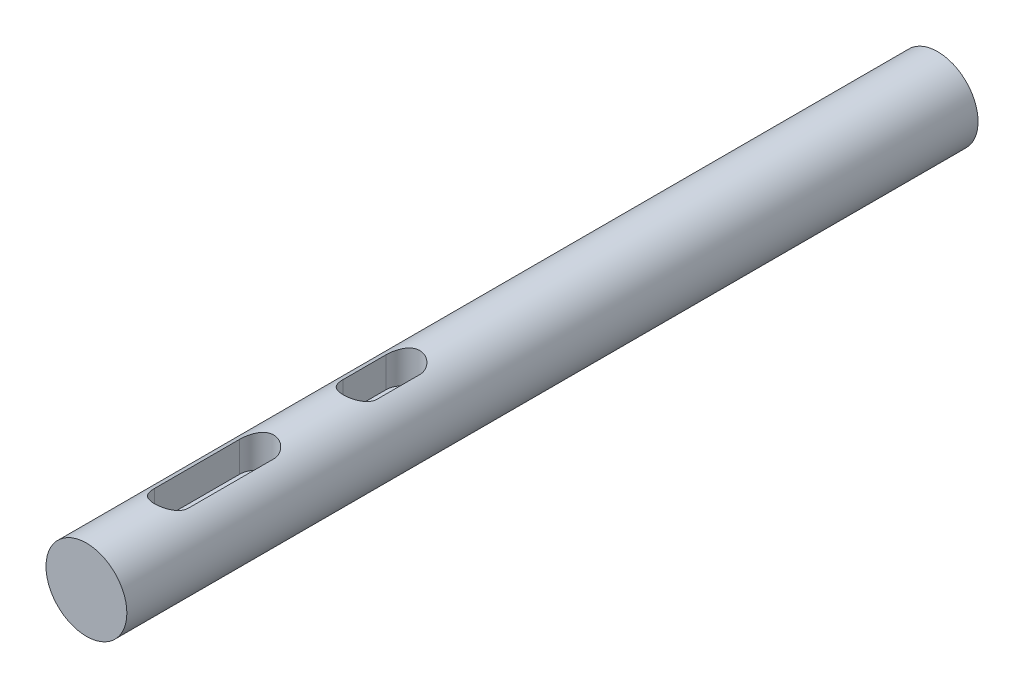
ISO-10303-21;
HEADER;
FILE_DESCRIPTION(('STEP AP214'),'2;1');
FILE_NAME('part.step','',(''),(''),'','','');
FILE_SCHEMA(('AUTOMOTIVE_DESIGN { 1 0 10303 214 1 1 1 1 }'));
ENDSEC;
DATA;
#1=APPLICATION_CONTEXT('core data for automotive mechanical design processes');
#2=APPLICATION_PROTOCOL_DEFINITION('international standard','automotive_design',2000,#1);
#3=PRODUCT_CONTEXT('',#1,'mechanical');
#4=PRODUCT('Part','Part','',(#3));
#5=PRODUCT_RELATED_PRODUCT_CATEGORY('part','',(#4));
#6=PRODUCT_DEFINITION_FORMATION('','',#4);
#7=PRODUCT_DEFINITION_CONTEXT('part definition',#1,'design');
#8=PRODUCT_DEFINITION('design','',#6,#7);
#9=PRODUCT_DEFINITION_SHAPE('','',#8);
#10=(LENGTH_UNIT() NAMED_UNIT(*) SI_UNIT(.MILLI.,.METRE.));
#11=(NAMED_UNIT(*) PLANE_ANGLE_UNIT() SI_UNIT($,.RADIAN.));
#12=(NAMED_UNIT(*) SI_UNIT($,.STERADIAN.) SOLID_ANGLE_UNIT());
#13=UNCERTAINTY_MEASURE_WITH_UNIT(LENGTH_MEASURE(1.E-05),#10,'distance_accuracy_value','');
#14=(GEOMETRIC_REPRESENTATION_CONTEXT(3) GLOBAL_UNCERTAINTY_ASSIGNED_CONTEXT((#13)) GLOBAL_UNIT_ASSIGNED_CONTEXT((#10,
#11,#12)) REPRESENTATION_CONTEXT('',''));
#15=CARTESIAN_POINT('',(0.,0.,0.));
#16=DIRECTION('',(0.,0.,1.));
#17=DIRECTION('',(1.,0.,0.));
#18=AXIS2_PLACEMENT_3D('',#15,#16,#17);
#19=CARTESIAN_POINT('',(0.,0.,0.0001));
#20=DIRECTION('',(0.,0.,-1.));
#21=DIRECTION('',(-1.,0.,0.));
#22=AXIS2_PLACEMENT_3D('',#19,#20,#21);
#23=CYLINDRICAL_SURFACE('',#22,4.75);
#24=CARTESIAN_POINT('',(0.,0.,0.0001));
#25=DIRECTION('',(0.,0.,1.));
#26=DIRECTION('',(1.,0.,0.));
#27=AXIS2_PLACEMENT_3D('',#24,#25,#26);
#28=CIRCLE('',#27,4.75);
#29=CARTESIAN_POINT('',(4.75,0.,0.0001));
#30=VERTEX_POINT('',#29);
#31=EDGE_CURVE('E130',#30,#30,#28,.T.);
#32=ORIENTED_EDGE('',*,*,#31,.F.);
#33=EDGE_LOOP('',(#32));
#34=FACE_BOUND('',#33,.T.);
#35=CARTESIAN_POINT('',(0.,4.75,-30.17));
#36=CARTESIAN_POINT('',(-0.107036462368458,4.74999105230106,-30.17001185467));
#37=CARTESIAN_POINT('',(-0.21423624616739,4.7463402994097,-30.1786434104685));
#38=CARTESIAN_POINT('',(-0.425593131869901,4.73208882609393,-30.2128608489265));
#39=CARTESIAN_POINT('',(-0.529741661649221,4.7214701827862,-30.238490455983));
#40=CARTESIAN_POINT('',(-0.731590406184853,4.69442284735135,-30.3055852054463));
#41=CARTESIAN_POINT('',(-0.829311330167874,4.67801402078023,-30.3469962416775));
#42=CARTESIAN_POINT('',(-1.01632284675021,4.64097919078582,-30.4442526428769));
#43=CARTESIAN_POINT('',(-1.10561588355067,4.62035441557184,-30.5000938052442));
#44=CARTESIAN_POINT('',(-1.27793883653739,4.57576887526126,-30.6276343007205));
#45=CARTESIAN_POINT('',(-1.36048223127562,4.55169736788395,-30.6999519132003));
#46=CARTESIAN_POINT('',(-1.51268912853782,4.50340541179333,-30.85708449633));
#47=CARTESIAN_POINT('',(-1.58234571599153,4.47918489027961,-30.9419061330397));
#48=CARTESIAN_POINT('',(-1.71027969557346,4.43196710928289,-31.126828163732));
#49=CARTESIAN_POINT('',(-1.76780496391063,4.40909335958272,-31.2274837575963));
#50=CARTESIAN_POINT('',(-1.86489069620241,4.36892020968375,-31.4381440439665));
#51=CARTESIAN_POINT('',(-1.90446060785823,4.35161787932547,-31.5481437835356));
#52=CARTESIAN_POINT('',(-1.9624924807831,4.32574780180008,-31.7687692649238));
#53=CARTESIAN_POINT('',(-1.98189190257055,4.31679434717452,-31.8791014276598));
#54=CARTESIAN_POINT('',(-2.00195562895775,4.30752932662971,-32.1017901438235));
#55=CARTESIAN_POINT('',(-2.00263058226538,4.30721284881607,-32.2141455102597));
#56=CARTESIAN_POINT('',(-1.98593120072107,4.31493181644962,-32.4282608732941));
#57=CARTESIAN_POINT('',(-1.96997131078922,4.32231278335099,-32.5301595623539));
#58=CARTESIAN_POINT('',(-1.92283162811082,4.3434869665329,-32.7296693785866));
#59=CARTESIAN_POINT('',(-1.89164884741754,4.35728144163054,-32.8272796599302));
#60=CARTESIAN_POINT('',(-1.81433790634178,4.39004171904363,-33.017933684794));
#61=CARTESIAN_POINT('',(-1.76790298398402,4.40911227810592,-33.1108342236556));
#62=CARTESIAN_POINT('',(-1.66162325591989,4.45025281005121,-33.2878910559781));
#63=CARTESIAN_POINT('',(-1.60177309979156,4.47232397828682,-33.3720438409003));
#64=CARTESIAN_POINT('',(-1.46428805277277,4.51930009875198,-33.5368756876891));
#65=CARTESIAN_POINT('',(-1.38556278942611,4.54428505688558,-33.6166250891941));
#66=CARTESIAN_POINT('',(-1.21561328405725,4.59266646060081,-33.7621054081883));
#67=CARTESIAN_POINT('',(-1.12438599890452,4.61606251734624,-33.8278329026005));
#68=CARTESIAN_POINT('',(-0.929145948219349,4.65933566537717,-33.9448065200699));
#69=CARTESIAN_POINT('',(-0.824878687890043,4.67911472030857,-33.9956668320559));
#70=CARTESIAN_POINT('',(-0.608222262411321,4.7121696275971,-34.0787972107732));
#71=CARTESIAN_POINT('',(-0.495837723966099,4.72544915152312,-34.1110777749758));
#72=CARTESIAN_POINT('',(-0.273899430083203,4.7433183819797,-34.1541687998687));
#73=CARTESIAN_POINT('',(-0.164628362907149,4.74841197266554,-34.1662264062904));
#74=CARTESIAN_POINT('',(0.0544859422097762,4.7509495140171,-34.1722568877003));
#75=CARTESIAN_POINT('',(0.164329001896027,4.74839572034202,-34.1662350953553));
#76=CARTESIAN_POINT('',(0.375578198064442,4.73625128095379,-34.1371637151306));
#77=CARTESIAN_POINT('',(0.477129162603386,4.72702550402368,-34.1149966286003));
#78=CARTESIAN_POINT('',(0.674955484098693,4.70285789767311,-34.0554995491865));
#79=CARTESIAN_POINT('',(0.771230176352193,4.68791534993975,-34.0181676508063));
#80=CARTESIAN_POINT('',(0.959158229909816,4.65316408364171,-33.9281831910779));
#81=CARTESIAN_POINT('',(1.05057430517146,4.63321831478799,-33.8750897202064));
#82=CARTESIAN_POINT('',(1.22352777344185,4.59058023824968,-33.7555727882067));
#83=CARTESIAN_POINT('',(1.30506098197808,4.56788677524527,-33.6891437120932));
#84=CARTESIAN_POINT('',(1.46218525430955,4.52014832220439,-33.5391786849425));
#85=CARTESIAN_POINT('',(1.53690971771378,4.49505251450344,-33.4547486253149));
#86=CARTESIAN_POINT('',(1.67137911518237,4.44680874465642,-33.2741596537413));
#87=CARTESIAN_POINT('',(1.73112037565901,4.42366126112372,-33.1779978739811));
#88=CARTESIAN_POINT('',(1.83465029067007,4.38175075287145,-32.9745369191052));
#89=CARTESIAN_POINT('',(1.87817619877721,4.3630615717636,-32.8670877008913));
#90=CARTESIAN_POINT('',(1.94613970779112,4.33317944385815,-32.6453490302796));
#91=CARTESIAN_POINT('',(1.9705934989139,4.32198014009814,-32.531065468458));
#92=CARTESIAN_POINT('',(1.99809365532078,4.30933055153169,-32.3085390720137));
#93=CARTESIAN_POINT('',(2.00266563478006,4.30718588214918,-32.2005234608846));
#94=CARTESIAN_POINT('',(1.99436289136938,4.31103684419066,-31.9853241375309));
#95=CARTESIAN_POINT('',(1.98149098638983,4.31703116084065,-31.8781402937551));
#96=CARTESIAN_POINT('',(1.93995635081153,4.33584430782861,-31.6730146088952));
#97=CARTESIAN_POINT('',(1.91209039204409,4.34831777145251,-31.574876697324));
#98=CARTESIAN_POINT('',(1.84214689268935,4.37840569203652,-31.3846514943026));
#99=CARTESIAN_POINT('',(1.80006534139776,4.39602159966499,-31.2925659191917));
#100=CARTESIAN_POINT('',(1.69994007024285,4.43573763071445,-31.1109424558704));
#101=CARTESIAN_POINT('',(1.64108110570075,4.45804534068644,-31.0219002611461));
#102=CARTESIAN_POINT('',(1.51020038304186,4.5040651794814,-30.85447943852));
#103=CARTESIAN_POINT('',(1.43817390715273,4.52777780960673,-30.7761046502453));
#104=CARTESIAN_POINT('',(1.27659022248804,4.57607254723289,-30.6261890161143));
#105=CARTESIAN_POINT('',(1.18612311549111,4.60058638516999,-30.5556022437799));
#106=CARTESIAN_POINT('',(0.993725379452199,4.64594055900097,-30.43055510456));
#107=CARTESIAN_POINT('',(0.891789570387904,4.66677922394583,-30.3761020654038));
#108=CARTESIAN_POINT('',(0.680840837781727,4.70215008458216,-30.2860131139673));
#109=CARTESIAN_POINT('',(0.571965756964761,4.71677703656465,-30.2500925274493));
#110=CARTESIAN_POINT('',(0.349166725075994,4.73846042696525,-30.1974127247087));
#111=CARTESIAN_POINT('',(0.235259686811359,4.74554047417122,-30.1805937425567));
#112=CARTESIAN_POINT('',(0.0806138559737813,4.74949001252044,-30.1712141009985));
#113=CARTESIAN_POINT('',(0.0403185146594547,4.75000337042091,-30.1699955345807));
#114=CARTESIAN_POINT('',(0.,4.75,-30.17));
#115=B_SPLINE_CURVE_WITH_KNOTS('',3,(#35,#36,#37,#38,#39,#40,#41,#42,#43,#44,#45,#46,#47,#48,
#49,#50,#51,#52,#53,#54,#55,#56,#57,#58,#59,#60,#61,#62,#63,#64,#65,#66,#67,#68,#69,#70,#71,#72,
#73,#74,#75,#76,#77,#78,#79,#80,#81,#82,#83,#84,#85,#86,#87,#88,#89,#90,#91,#92,#93,#94,#95,#96,
#97,#98,#99,#100,#101,#102,#103,#104,#105,#106,#107,#108,#109,#110,#111,#112,#113,#114),
.UNSPECIFIED.,.T.,.F.,(4,2,2,2,2,2,2,2,2,2,2,2,2,2,2,2,2,2,2,2,2,2,2,2,2,2,2,2,2,2,2,2,2,2,2,2,
2,2,2,4),(0.,0.320992833427258,0.642814581763423,0.963542757751976,1.2841776305755,
1.61977067727506,1.95554328441994,2.30826935782324,2.66080961894182,2.99611267136669,
3.33122503119564,3.63999866694788,3.94883293312584,4.26430374352242,4.57990059829875,
4.92278837411685,5.26575976135262,5.61697022291763,5.96798205692134,6.29642217319481,
6.62476542288596,6.93639255342285,7.24805885281148,7.56943103565565,7.89093881783371,
8.23588662956777,8.58091893324744,8.93132109614983,9.28142547982679,9.60412990992077,
9.92678221645596,10.2337737894146,10.5408520476219,10.8666093059307,11.1924835089913,
11.5428100141678,11.8932953899746,12.2382234684013,12.5820693217041,12.7029809622212),.UNSPECIFIED.);
#116=CARTESIAN_POINT('',(2.,4.30842198490352,-32.17));
#117=VERTEX_POINT('',#116);
#118=CARTESIAN_POINT('',(-2.,4.30842198490353,-32.17));
#119=VERTEX_POINT('',#118);
#120=EDGE_CURVE('E162',#117,#119,#115,.T.);
#121=ORIENTED_EDGE('',*,*,#120,.T.);
#122=DIRECTION('',(0.,0.,-1.));
#123=VECTOR('',#122,1.);
#124=CARTESIAN_POINT('',(-1.99999999999999,4.30842198490353,0.000100000000000347));
#125=LINE('',#124,#123);
#126=CARTESIAN_POINT('',(-2.,4.30842198490352,-37.17));
#127=VERTEX_POINT('',#126);
#128=EDGE_CURVE('E226',#119,#127,#125,.T.);
#129=ORIENTED_EDGE('',*,*,#128,.T.);
#130=CARTESIAN_POINT('',(-2.,4.30842198490352,-37.17));
#131=CARTESIAN_POINT('',(-2.00000825897847,4.30841011380863,-37.2235345521795));
#132=CARTESIAN_POINT('',(-1.99785077580663,4.30941948868661,-37.2770626203057));
#133=CARTESIAN_POINT('',(-1.98926895598115,4.31339190043556,-37.3836806605893));
#134=CARTESIAN_POINT('',(-1.98284642205527,4.31635411188867,-37.4367708082498));
#135=CARTESIAN_POINT('',(-1.96583546331159,4.32412685921061,-37.5419086170322));
#136=CARTESIAN_POINT('',(-1.95526496151924,4.32892944092505,-37.5939597640355));
#137=CARTESIAN_POINT('',(-1.93008063678102,4.34021639850274,-37.696876490161));
#138=CARTESIAN_POINT('',(-1.91546652876178,4.34670089293847,-37.7477419854209));
#139=CARTESIAN_POINT('',(-1.86580159284002,4.36836357128854,-37.8979210577477));
#140=CARTESIAN_POINT('',(-1.82489049441326,4.38576927521462,-37.9950461623364));
#141=CARTESIAN_POINT('',(-1.72877761751094,4.42453395003012,-38.1811028015002));
#142=CARTESIAN_POINT('',(-1.67356058478862,4.44589713376059,-38.2700254518071));
#143=CARTESIAN_POINT('',(-1.5466970330628,4.49166147940215,-38.4427314297968));
#144=CARTESIAN_POINT('',(-1.47429275333466,4.51616643744312,-38.525931880412));
#145=CARTESIAN_POINT('',(-1.31671324923857,4.56459815123146,-38.6794276951558));
#146=CARTESIAN_POINT('',(-1.23153526514576,4.58852478073221,-38.7497202632527));
#147=CARTESIAN_POINT('',(-1.04615818529679,4.63438845471728,-38.8784609802936));
#148=CARTESIAN_POINT('',(-0.945458954563406,4.65618937738373,-38.9362419568379));
#149=CARTESIAN_POINT('',(-0.734686045460851,4.69405729356391,-39.0337873533974));
#150=CARTESIAN_POINT('',(-0.624616680062105,4.7101269076484,-39.0735600097447));
#151=CARTESIAN_POINT('',(-0.404416494415531,4.73397850916716,-39.1318156799075));
#152=CARTESIAN_POINT('',(-0.294598268754073,4.74215468693835,-39.1513155455394));
#153=CARTESIAN_POINT('',(-0.0729626666572654,4.75073206966691,-39.171761025194));
#154=CARTESIAN_POINT('',(0.0388538989780606,4.75113635936249,-39.1727140006602));
#155=CARTESIAN_POINT('',(0.253905429928729,4.74435398903119,-39.1565639230233));
#156=CARTESIAN_POINT('',(0.357241980790298,4.73763734019635,-39.1405788841423));
#157=CARTESIAN_POINT('',(0.559604839076462,4.71801662503928,-39.0929274930626));
#158=CARTESIAN_POINT('',(0.658630904250331,4.70511221145107,-39.0612602607541));
#159=CARTESIAN_POINT('',(0.851386562974535,4.67411215558031,-38.9827713127215));
#160=CARTESIAN_POINT('',(0.945012060118187,4.65594017778792,-38.9357253519174));
#161=CARTESIAN_POINT('',(1.12328635555474,4.61617617583575,-38.8280359818032));
#162=CARTESIAN_POINT('',(1.20793184001567,4.59458289641562,-38.7673875784103));
#163=CARTESIAN_POINT('',(1.37229261321633,4.54830925830985,-38.6291622640776));
#164=CARTESIAN_POINT('',(1.45121931903451,4.52351856467951,-38.5506833973799));
#165=CARTESIAN_POINT('',(1.59514685474077,4.47479534120691,-38.381545978794));
#166=CARTESIAN_POINT('',(1.66014041317758,4.45086326485933,-38.2908811072161));
#167=CARTESIAN_POINT('',(1.77646069116463,4.40576013472035,-38.0960160087572));
#168=CARTESIAN_POINT('',(1.82723508960302,4.38471366190087,-37.9914553439709));
#169=CARTESIAN_POINT('',(1.91007593515835,4.34927203726821,-37.774204674537));
#170=CARTESIAN_POINT('',(1.94217723884358,4.33486450324615,-37.6615302605158));
#171=CARTESIAN_POINT('',(1.97608704818706,4.31946072439427,-37.4847505888374));
#172=CARTESIAN_POINT('',(1.98503842328058,4.31534376229517,-37.4222078904901));
#173=CARTESIAN_POINT('',(1.99699778436201,4.30981639016708,-37.2964577129161));
#174=CARTESIAN_POINT('',(2.00000744288469,4.30840521848792,-37.2332504258025));
#175=CARTESIAN_POINT('',(2.,4.30842198490352,-37.17));
#176=B_SPLINE_CURVE_WITH_KNOTS('',3,(#130,#131,#132,#133,#134,#135,#136,#137,#138,#139,#140,
#141,#142,#143,#144,#145,#146,#147,#148,#149,#150,#151,#152,#153,#154,#155,#156,#157,#158,#159,
#160,#161,#162,#163,#164,#165,#166,#167,#168,#169,#170,#171,#172,#173,#174,#175),.UNSPECIFIED.,
.F.,.F.,(4,2,2,2,2,2,2,2,2,2,2,2,2,2,2,2,2,2,2,2,2,2,4),(0.,0.160539924110354,0.321012035258062,
0.480798262488674,0.640595757485577,0.959501305052971,1.27874830739583,1.61621382147964,
1.95375234940693,2.30632810114732,2.65874243463347,2.9924742228871,3.32607354700202,
3.63894872966082,3.95184147336606,4.26951694268118,4.58730923676542,4.9278860236913,
5.26864012095079,5.62121508050695,5.9731297681016,6.16276560227239,6.35234804820541),.UNSPECIFIED.);
#177=CARTESIAN_POINT('',(2.,4.30842198490352,-37.17));
#178=VERTEX_POINT('',#177);
#179=EDGE_CURVE('E155',#127,#178,#176,.T.);
#180=ORIENTED_EDGE('',*,*,#179,.T.);
#181=DIRECTION('',(0.,0.,-1.));
#182=VECTOR('',#181,1.);
#183=CARTESIAN_POINT('',(2.00000000000001,4.30842198490352,9.99999999996531E-05));
#184=LINE('',#183,#182);
#185=EDGE_CURVE('E238',#178,#117,#184,.F.);
#186=ORIENTED_EDGE('',*,*,#185,.T.);
#187=EDGE_LOOP('',(#121,#129,#180,#186));
#188=FACE_BOUND('',#187,.T.);
#189=CARTESIAN_POINT('',(0.,4.75,-8.));
#190=CARTESIAN_POINT('',(-0.107036462368458,4.74999105230106,-8.00001185467003));
#191=CARTESIAN_POINT('',(-0.21423624616739,4.7463402994097,-8.00864341046847));
#192=CARTESIAN_POINT('',(-0.425593131869901,4.73208882609393,-8.04286084892646));
#193=CARTESIAN_POINT('',(-0.52974166164922,4.7214701827862,-8.06849045598295));
#194=CARTESIAN_POINT('',(-0.731590406184852,4.69442284735135,-8.13558520544629));
#195=CARTESIAN_POINT('',(-0.829311330167874,4.67801402078023,-8.17699624167746));
#196=CARTESIAN_POINT('',(-1.01632284675021,4.64097919078582,-8.27425264287692));
#197=CARTESIAN_POINT('',(-1.10561588355067,4.62035441557184,-8.33009380524416));
#198=CARTESIAN_POINT('',(-1.27793883653739,4.57576887526126,-8.45763430072049));
#199=CARTESIAN_POINT('',(-1.36048223127562,4.55169736788395,-8.5299519132003));
#200=CARTESIAN_POINT('',(-1.51268912853782,4.50340541179333,-8.68708449633));
#201=CARTESIAN_POINT('',(-1.58234571599153,4.47918489027961,-8.77190613303968));
#202=CARTESIAN_POINT('',(-1.71027969557345,4.43196710928289,-8.95682816373201));
#203=CARTESIAN_POINT('',(-1.76780496391063,4.40909335958272,-9.05748375759631));
#204=CARTESIAN_POINT('',(-1.86489069620241,4.36892020968375,-9.26814404396651));
#205=CARTESIAN_POINT('',(-1.90446060785823,4.35161787932547,-9.37814378353564));
#206=CARTESIAN_POINT('',(-1.9624924807831,4.32574780180008,-9.59876926492375));
#207=CARTESIAN_POINT('',(-1.98189190257055,4.31679434717452,-9.70910142765978));
#208=CARTESIAN_POINT('',(-2.00195562895774,4.30752932662971,-9.93179014382348));
#209=CARTESIAN_POINT('',(-2.00263058226538,4.30721284881607,-10.0441455102597));
#210=CARTESIAN_POINT('',(-1.98593120072107,4.31493181644962,-10.2582608732941));
#211=CARTESIAN_POINT('',(-1.96997131078922,4.32231278335099,-10.3601595623539));
#212=CARTESIAN_POINT('',(-1.92283162811082,4.34348696653289,-10.5596693785866));
#213=CARTESIAN_POINT('',(-1.89164884741754,4.35728144163054,-10.6572796599302));
#214=CARTESIAN_POINT('',(-1.81433790634178,4.39004171904363,-10.847933684794));
#215=CARTESIAN_POINT('',(-1.76790298398402,4.40911227810592,-10.9408342236556));
#216=CARTESIAN_POINT('',(-1.66162325591989,4.45025281005121,-11.1178910559781));
#217=CARTESIAN_POINT('',(-1.60177309979156,4.47232397828682,-11.2020438409003));
#218=CARTESIAN_POINT('',(-1.46428805277278,4.51930009875198,-11.3668756876891));
#219=CARTESIAN_POINT('',(-1.38556278942612,4.54428505688558,-11.4466250891941));
#220=CARTESIAN_POINT('',(-1.21561328405725,4.59266646060081,-11.5921054081883));
#221=CARTESIAN_POINT('',(-1.12438599890452,4.61606251734623,-11.6578329026005));
#222=CARTESIAN_POINT('',(-0.929145948219353,4.65933566537717,-11.7748065200699));
#223=CARTESIAN_POINT('',(-0.824878687890046,4.67911472030857,-11.8256668320559));
#224=CARTESIAN_POINT('',(-0.608222262411322,4.7121696275971,-11.9087972107732));
#225=CARTESIAN_POINT('',(-0.495837723966099,4.72544915152312,-11.9410777749758));
#226=CARTESIAN_POINT('',(-0.273899430083202,4.7433183819797,-11.9841687998686));
#227=CARTESIAN_POINT('',(-0.164628362907148,4.74841197266554,-11.9962264062903));
#228=CARTESIAN_POINT('',(0.0544859422097765,4.7509495140171,-12.0022568877003));
#229=CARTESIAN_POINT('',(0.164329001896028,4.74839572034202,-11.9962350953553));
#230=CARTESIAN_POINT('',(0.375578198064442,4.73625128095379,-11.9671637151306));
#231=CARTESIAN_POINT('',(0.477129162603386,4.72702550402368,-11.9449966286002));
#232=CARTESIAN_POINT('',(0.674955484098694,4.70285789767311,-11.8854995491865));
#233=CARTESIAN_POINT('',(0.771230176352194,4.68791534993975,-11.8481676508063));
#234=CARTESIAN_POINT('',(0.959158229909817,4.65316408364171,-11.7581831910779));
#235=CARTESIAN_POINT('',(1.05057430517146,4.63321831478799,-11.7050897202064));
#236=CARTESIAN_POINT('',(1.22352777344185,4.59058023824968,-11.5855727882067));
#237=CARTESIAN_POINT('',(1.30506098197807,4.56788677524527,-11.5191437120931));
#238=CARTESIAN_POINT('',(1.46218525430955,4.52014832220439,-11.3691786849424));
#239=CARTESIAN_POINT('',(1.53690971771379,4.49505251450344,-11.2847486253149));
#240=CARTESIAN_POINT('',(1.67137911518237,4.44680874465642,-11.1041596537413));
#241=CARTESIAN_POINT('',(1.73112037565902,4.42366126112372,-11.0079978739811));
#242=CARTESIAN_POINT('',(1.83465029067007,4.38175075287145,-10.8045369191052));
#243=CARTESIAN_POINT('',(1.87817619877721,4.3630615717636,-10.6970877008913));
#244=CARTESIAN_POINT('',(1.94613970779112,4.33317944385815,-10.4753490302796));
#245=CARTESIAN_POINT('',(1.9705934989139,4.32198014009814,-10.361065468458));
#246=CARTESIAN_POINT('',(1.99809365532078,4.30933055153169,-10.1385390720137));
#247=CARTESIAN_POINT('',(2.00266563478006,4.30718588214918,-10.0305234608846));
#248=CARTESIAN_POINT('',(1.99436289136938,4.31103684419066,-9.81532413753089));
#249=CARTESIAN_POINT('',(1.98149098638983,4.31703116084065,-9.70814029375512));
#250=CARTESIAN_POINT('',(1.93995635081153,4.33584430782861,-9.50301460889519));
#251=CARTESIAN_POINT('',(1.91209039204409,4.34831777145251,-9.40487669732396));
#252=CARTESIAN_POINT('',(1.84214689268935,4.37840569203651,-9.21465149430263));
#253=CARTESIAN_POINT('',(1.80006534139776,4.39602159966499,-9.12256591919172));
#254=CARTESIAN_POINT('',(1.69994007024285,4.43573763071445,-8.94094245587041));
#255=CARTESIAN_POINT('',(1.64108110570075,4.45804534068644,-8.85190026114613));
#256=CARTESIAN_POINT('',(1.51020038304186,4.5040651794814,-8.68447943852002));
#257=CARTESIAN_POINT('',(1.43817390715273,4.52777780960673,-8.60610465024526));
#258=CARTESIAN_POINT('',(1.27659022248804,4.57607254723289,-8.4561890161143));
#259=CARTESIAN_POINT('',(1.18612311549111,4.60058638517,-8.38560224377989));
#260=CARTESIAN_POINT('',(0.993725379452199,4.64594055900097,-8.26055510456004));
#261=CARTESIAN_POINT('',(0.891789570387903,4.66677922394583,-8.20610206540375));
#262=CARTESIAN_POINT('',(0.680840837781725,4.70215008458216,-8.11601311396725));
#263=CARTESIAN_POINT('',(0.571965756964757,4.71677703656465,-8.08009252744934));
#264=CARTESIAN_POINT('',(0.349166725075991,4.73846042696525,-8.02741272470871));
#265=CARTESIAN_POINT('',(0.235259686811356,4.74554047417122,-8.01059374255665));
#266=CARTESIAN_POINT('',(0.08061385597378,4.74949001252044,-8.00121410099845));
#267=CARTESIAN_POINT('',(0.040318514659454,4.75000337042091,-7.99999553458068));
#268=CARTESIAN_POINT('',(0.,4.75,-8.));
#269=B_SPLINE_CURVE_WITH_KNOTS('',3,(#189,#190,#191,#192,#193,#194,#195,#196,#197,#198,#199,
#200,#201,#202,#203,#204,#205,#206,#207,#208,#209,#210,#211,#212,#213,#214,#215,#216,#217,#218,
#219,#220,#221,#222,#223,#224,#225,#226,#227,#228,#229,#230,#231,#232,#233,#234,#235,#236,#237,
#238,#239,#240,#241,#242,#243,#244,#245,#246,#247,#248,#249,#250,#251,#252,#253,#254,#255,#256,
#257,#258,#259,#260,#261,#262,#263,#264,#265,#266,#267,#268),.UNSPECIFIED.,.T.,.F.,(4,2,2,2,2,2,
2,2,2,2,2,2,2,2,2,2,2,2,2,2,2,2,2,2,2,2,2,2,2,2,2,2,2,2,2,2,2,2,2,4),(0.,0.320992833427258,
0.642814581763423,0.963542757751975,1.2841776305755,1.61977067727506,1.95554328441993,
2.30826935782324,2.66080961894182,2.99611267136669,3.33122503119565,3.63999866694788,
3.94883293312584,4.26430374352242,4.57990059829875,4.92278837411684,5.26575976135261,
5.61697022291762,5.96798205692134,6.29642217319481,6.62476542288596,6.93639255342285,
7.24805885281148,7.56943103565565,7.89093881783371,8.23588662956778,8.58091893324743,
8.93132109614982,9.28142547982678,9.60412990992076,9.92678221645596,10.2337737894146,
10.5408520476219,10.8666093059307,11.1924835089913,11.5428100141678,11.8932953899746,
12.2382234684013,12.5820693217041,12.7029809622212),.UNSPECIFIED.);
#270=CARTESIAN_POINT('',(2.,4.30842198490352,-10.));
#271=VERTEX_POINT('',#270);
#272=CARTESIAN_POINT('',(-2.,4.30842198490352,-10.));
#273=VERTEX_POINT('',#272);
#274=EDGE_CURVE('E102',#271,#273,#269,.T.);
#275=ORIENTED_EDGE('',*,*,#274,.T.);
#276=DIRECTION('',(0.,0.,-1.));
#277=VECTOR('',#276,1.);
#278=CARTESIAN_POINT('',(-2.,4.30842198490352,0.0001));
#279=LINE('',#278,#277);
#280=CARTESIAN_POINT('',(-2.,4.30842198490352,-20.));
#281=VERTEX_POINT('',#280);
#282=EDGE_CURVE('E11',#273,#281,#279,.T.);
#283=ORIENTED_EDGE('',*,*,#282,.T.);
#284=CARTESIAN_POINT('',(-2.,4.30842198490352,-20.));
#285=CARTESIAN_POINT('',(-2.00000825897847,4.30841011380863,-20.0535345521795));
#286=CARTESIAN_POINT('',(-1.99785077580663,4.30941948868661,-20.1070626203057));
#287=CARTESIAN_POINT('',(-1.98926895598115,4.31339190043556,-20.2136806605892));
#288=CARTESIAN_POINT('',(-1.98284642205527,4.31635411188867,-20.2667708082498));
#289=CARTESIAN_POINT('',(-1.96583546331159,4.32412685921061,-20.3719086170322));
#290=CARTESIAN_POINT('',(-1.95526496151924,4.32892944092505,-20.4239597640355));
#291=CARTESIAN_POINT('',(-1.93008063678102,4.34021639850275,-20.526876490161));
#292=CARTESIAN_POINT('',(-1.91546652876178,4.34670089293847,-20.5777419854209));
#293=CARTESIAN_POINT('',(-1.86580159284002,4.36836357128854,-20.7279210577477));
#294=CARTESIAN_POINT('',(-1.82489049441326,4.38576927521462,-20.8250461623364));
#295=CARTESIAN_POINT('',(-1.72877761751093,4.42453395003012,-21.0111028015002));
#296=CARTESIAN_POINT('',(-1.67356058478861,4.44589713376059,-21.1000254518071));
#297=CARTESIAN_POINT('',(-1.5466970330628,4.49166147940215,-21.2727314297968));
#298=CARTESIAN_POINT('',(-1.47429275333466,4.51616643744312,-21.355931880412));
#299=CARTESIAN_POINT('',(-1.31671324923856,4.56459815123147,-21.5094276951558));
#300=CARTESIAN_POINT('',(-1.23153526514576,4.58852478073221,-21.5797202632527));
#301=CARTESIAN_POINT('',(-1.04615818529679,4.63438845471728,-21.7084609802936));
#302=CARTESIAN_POINT('',(-0.945458954563405,4.65618937738373,-21.7662419568379));
#303=CARTESIAN_POINT('',(-0.734686045460848,4.69405729356391,-21.8637873533973));
#304=CARTESIAN_POINT('',(-0.624616680062101,4.71012690764841,-21.9035600097447));
#305=CARTESIAN_POINT('',(-0.404416494415526,4.73397850916716,-21.9618156799075));
#306=CARTESIAN_POINT('',(-0.294598268754068,4.74215468693835,-21.9813155455394));
#307=CARTESIAN_POINT('',(-0.0729626666572619,4.75073206966691,-22.001761025194));
#308=CARTESIAN_POINT('',(0.0388538989780636,4.75113635936249,-22.0027140006602));
#309=CARTESIAN_POINT('',(0.253905429928732,4.74435398903119,-21.9865639230233));
#310=CARTESIAN_POINT('',(0.357241980790301,4.73763734019635,-21.9705788841423));
#311=CARTESIAN_POINT('',(0.559604839076466,4.71801662503928,-21.9229274930626));
#312=CARTESIAN_POINT('',(0.658630904250334,4.70511221145107,-21.8912602607541));
#313=CARTESIAN_POINT('',(0.851386562974538,4.67411215558031,-21.8127713127215));
#314=CARTESIAN_POINT('',(0.94501206011819,4.65594017778792,-21.7657253519174));
#315=CARTESIAN_POINT('',(1.12328635555474,4.61617617583575,-21.6580359818032));
#316=CARTESIAN_POINT('',(1.20793184001568,4.59458289641562,-21.5973875784103));
#317=CARTESIAN_POINT('',(1.37229261321633,4.54830925830985,-21.4591622640776));
#318=CARTESIAN_POINT('',(1.45121931903451,4.52351856467951,-21.3806833973799));
#319=CARTESIAN_POINT('',(1.59514685474077,4.47479534120691,-21.211545978794));
#320=CARTESIAN_POINT('',(1.66014041317758,4.45086326485933,-21.1208811072161));
#321=CARTESIAN_POINT('',(1.77646069116463,4.40576013472035,-20.9260160087572));
#322=CARTESIAN_POINT('',(1.82723508960302,4.38471366190087,-20.8214553439709));
#323=CARTESIAN_POINT('',(1.91007593515836,4.34927203726821,-20.6042046745369));
#324=CARTESIAN_POINT('',(1.94217723884358,4.33486450324615,-20.4915302605157));
#325=CARTESIAN_POINT('',(1.97608704818706,4.31946072439427,-20.3147505888374));
#326=CARTESIAN_POINT('',(1.98503842328058,4.31534376229517,-20.2522078904901));
#327=CARTESIAN_POINT('',(1.99699778436201,4.30981639016708,-20.1264577129161));
#328=CARTESIAN_POINT('',(2.00000744288469,4.30840521848792,-20.0632504258025));
#329=CARTESIAN_POINT('',(2.,4.30842198490352,-20.));
#330=B_SPLINE_CURVE_WITH_KNOTS('',3,(#284,#285,#286,#287,#288,#289,#290,#291,#292,#293,#294,
#295,#296,#297,#298,#299,#300,#301,#302,#303,#304,#305,#306,#307,#308,#309,#310,#311,#312,#313,
#314,#315,#316,#317,#318,#319,#320,#321,#322,#323,#324,#325,#326,#327,#328,#329),.UNSPECIFIED.,
.F.,.F.,(4,2,2,2,2,2,2,2,2,2,2,2,2,2,2,2,2,2,2,2,2,2,4),(0.,0.160539924110347,0.321012035258066,
0.480798262488678,0.64059575748558,0.95950130505298,1.27874830739584,1.61621382147965,
1.95375234940693,2.30632810114732,2.65874243463348,2.99247422288711,3.32607354700202,
3.63894872966083,3.95184147336606,4.26951694268118,4.58730923676543,4.9278860236913,
5.26864012095079,5.62121508050696,5.9731297681016,6.16276560227239,6.3523480482054),.UNSPECIFIED.);
#331=CARTESIAN_POINT('',(2.,4.30842198490352,-20.));
#332=VERTEX_POINT('',#331);
#333=EDGE_CURVE('E219',#281,#332,#330,.T.);
#334=ORIENTED_EDGE('',*,*,#333,.T.);
#335=DIRECTION('',(0.,0.,-1.));
#336=VECTOR('',#335,1.);
#337=CARTESIAN_POINT('',(2.,4.30842198490352,0.0001));
#338=LINE('',#337,#336);
#339=EDGE_CURVE('E41',#332,#271,#338,.F.);
#340=ORIENTED_EDGE('',*,*,#339,.T.);
#341=EDGE_LOOP('',(#275,#283,#334,#340));
#342=FACE_BOUND('',#341,.T.);
#343=CARTESIAN_POINT('',(0.,0.,-100.));
#344=DIRECTION('',(0.,0.,-1.));
#345=DIRECTION('',(-1.,0.,0.));
#346=AXIS2_PLACEMENT_3D('',#343,#344,#345);
#347=CIRCLE('',#346,4.75);
#348=CARTESIAN_POINT('',(-4.75,0.,-100.));
#349=VERTEX_POINT('',#348);
#350=EDGE_CURVE('E124',#349,#349,#347,.T.);
#351=ORIENTED_EDGE('',*,*,#350,.F.);
#352=EDGE_LOOP('',(#351));
#353=FACE_BOUND('',#352,.T.);
#354=ADVANCED_FACE('F33',(#34,#188,#342,#353),#23,.T.);
#355=CARTESIAN_POINT('',(0.,0.,0.0001));
#356=DIRECTION('',(0.,0.,1.));
#357=DIRECTION('',(1.,0.,0.));
#358=AXIS2_PLACEMENT_3D('',#355,#356,#357);
#359=PLANE('',#358);
#360=ORIENTED_EDGE('',*,*,#31,.T.);
#361=EDGE_LOOP('',(#360));
#362=FACE_BOUND('',#361,.T.);
#363=ADVANCED_FACE('F181',(#362),#359,.T.);
#364=CARTESIAN_POINT('',(0.,0.750000000000001,-32.17));
#365=DIRECTION('',(0.,1.,0.));
#366=DIRECTION('',(0.,0.,1.));
#367=AXIS2_PLACEMENT_3D('',#364,#365,#366);
#368=CYLINDRICAL_SURFACE('',#367,2.);
#369=ORIENTED_EDGE('',*,*,#120,.F.);
#370=DIRECTION('',(0.,1.,0.));
#371=VECTOR('',#370,1.);
#372=CARTESIAN_POINT('',(2.,0.750000000000001,-32.17));
#373=LINE('',#372,#371);
#374=CARTESIAN_POINT('',(2.,0.750000000000001,-32.17));
#375=VERTEX_POINT('',#374);
#376=EDGE_CURVE('E56',#375,#117,#373,.T.);
#377=ORIENTED_EDGE('',*,*,#376,.F.);
#378=CARTESIAN_POINT('',(0.,0.750000000000001,-32.17));
#379=DIRECTION('',(0.,1.,0.));
#380=DIRECTION('',(0.,0.,1.));
#381=AXIS2_PLACEMENT_3D('',#378,#379,#380);
#382=CIRCLE('',#381,2.);
#383=CARTESIAN_POINT('',(-2.,0.750000000000001,-32.17));
#384=VERTEX_POINT('',#383);
#385=EDGE_CURVE('E135',#384,#375,#382,.T.);
#386=ORIENTED_EDGE('',*,*,#385,.F.);
#387=DIRECTION('',(0.,1.,0.));
#388=VECTOR('',#387,1.);
#389=CARTESIAN_POINT('',(-2.,0.750000000000001,-32.17));
#390=LINE('',#389,#388);
#391=EDGE_CURVE('E118',#384,#119,#390,.T.);
#392=ORIENTED_EDGE('',*,*,#391,.T.);
#393=EDGE_LOOP('',(#369,#377,#386,#392));
#394=FACE_BOUND('',#393,.T.);
#395=ADVANCED_FACE('F178',(#394),#368,.F.);
#396=CARTESIAN_POINT('',(-2.,0.750000000000001,-32.17));
#397=DIRECTION('',(-1.,0.,0.));
#398=DIRECTION('',(0.,0.,1.));
#399=AXIS2_PLACEMENT_3D('',#396,#397,#398);
#400=PLANE('',#399);
#401=ORIENTED_EDGE('',*,*,#391,.F.);
#402=DIRECTION('',(0.,0.,1.));
#403=VECTOR('',#402,1.);
#404=CARTESIAN_POINT('',(-2.,0.750000000000001,-32.17));
#405=LINE('',#404,#403);
#406=CARTESIAN_POINT('',(-2.,0.750000000000001,-37.17));
#407=VERTEX_POINT('',#406);
#408=EDGE_CURVE('E144',#407,#384,#405,.T.);
#409=ORIENTED_EDGE('',*,*,#408,.F.);
#410=DIRECTION('',(0.,1.,0.));
#411=VECTOR('',#410,1.);
#412=CARTESIAN_POINT('',(-2.,0.750000000000001,-37.17));
#413=LINE('',#412,#411);
#414=EDGE_CURVE('E121',#407,#127,#413,.T.);
#415=ORIENTED_EDGE('',*,*,#414,.T.);
#416=ORIENTED_EDGE('',*,*,#128,.F.);
#417=EDGE_LOOP('',(#401,#409,#415,#416));
#418=FACE_BOUND('',#417,.T.);
#419=ADVANCED_FACE('F173',(#418),#400,.F.);
#420=CARTESIAN_POINT('',(0.,0.750000000000001,-37.17));
#421=DIRECTION('',(0.,1.,0.));
#422=DIRECTION('',(0.,0.,1.));
#423=AXIS2_PLACEMENT_3D('',#420,#421,#422);
#424=CYLINDRICAL_SURFACE('',#423,2.);
#425=ORIENTED_EDGE('',*,*,#414,.F.);
#426=CARTESIAN_POINT('',(0.,0.750000000000001,-37.17));
#427=DIRECTION('',(0.,1.,0.));
#428=DIRECTION('',(0.,0.,1.));
#429=AXIS2_PLACEMENT_3D('',#426,#427,#428);
#430=CIRCLE('',#429,2.);
#431=CARTESIAN_POINT('',(2.,0.750000000000001,-37.17));
#432=VERTEX_POINT('',#431);
#433=EDGE_CURVE('E141',#432,#407,#430,.T.);
#434=ORIENTED_EDGE('',*,*,#433,.F.);
#435=DIRECTION('',(0.,1.,0.));
#436=VECTOR('',#435,1.);
#437=CARTESIAN_POINT('',(2.,0.750000000000001,-37.17));
#438=LINE('',#437,#436);
#439=EDGE_CURVE('E149',#432,#178,#438,.T.);
#440=ORIENTED_EDGE('',*,*,#439,.T.);
#441=ORIENTED_EDGE('',*,*,#179,.F.);
#442=EDGE_LOOP('',(#425,#434,#440,#441));
#443=FACE_BOUND('',#442,.T.);
#444=ADVANCED_FACE('F167',(#443),#424,.F.);
#445=CARTESIAN_POINT('',(2.,0.750000000000001,-32.17));
#446=DIRECTION('',(1.,0.,0.));
#447=DIRECTION('',(0.,0.,-1.));
#448=AXIS2_PLACEMENT_3D('',#445,#446,#447);
#449=PLANE('',#448);
#450=ORIENTED_EDGE('',*,*,#439,.F.);
#451=DIRECTION('',(0.,0.,-1.));
#452=VECTOR('',#451,1.);
#453=CARTESIAN_POINT('',(2.,0.750000000000001,-32.17));
#454=LINE('',#453,#452);
#455=EDGE_CURVE('E138',#375,#432,#454,.T.);
#456=ORIENTED_EDGE('',*,*,#455,.F.);
#457=ORIENTED_EDGE('',*,*,#376,.T.);
#458=ORIENTED_EDGE('',*,*,#185,.F.);
#459=EDGE_LOOP('',(#450,#456,#457,#458));
#460=FACE_BOUND('',#459,.T.);
#461=ADVANCED_FACE('F172',(#460),#449,.F.);
#462=CARTESIAN_POINT('',(0.,0.750000000000001,-32.17));
#463=DIRECTION('',(0.,1.,0.));
#464=DIRECTION('',(0.,0.,1.));
#465=AXIS2_PLACEMENT_3D('',#462,#463,#464);
#466=PLANE('',#465);
#467=ORIENTED_EDGE('',*,*,#385,.T.);
#468=ORIENTED_EDGE('',*,*,#455,.T.);
#469=ORIENTED_EDGE('',*,*,#433,.T.);
#470=ORIENTED_EDGE('',*,*,#408,.T.);
#471=EDGE_LOOP('',(#467,#468,#469,#470));
#472=FACE_BOUND('',#471,.T.);
#473=ADVANCED_FACE('F177',(#472),#466,.T.);
#474=CARTESIAN_POINT('',(0.,0.750000000000001,-10.));
#475=DIRECTION('',(0.,1.,0.));
#476=DIRECTION('',(0.,0.,1.));
#477=AXIS2_PLACEMENT_3D('',#474,#475,#476);
#478=CYLINDRICAL_SURFACE('',#477,2.);
#479=ORIENTED_EDGE('',*,*,#274,.F.);
#480=DIRECTION('',(0.,1.,0.));
#481=VECTOR('',#480,1.);
#482=CARTESIAN_POINT('',(2.,0.750000000000001,-10.));
#483=LINE('',#482,#481);
#484=CARTESIAN_POINT('',(2.,0.750000000000001,-10.));
#485=VERTEX_POINT('',#484);
#486=EDGE_CURVE('E48',#485,#271,#483,.T.);
#487=ORIENTED_EDGE('',*,*,#486,.F.);
#488=CARTESIAN_POINT('',(0.,0.750000000000001,-10.));
#489=DIRECTION('',(0.,1.,0.));
#490=DIRECTION('',(0.,0.,1.));
#491=AXIS2_PLACEMENT_3D('',#488,#489,#490);
#492=CIRCLE('',#491,2.);
#493=CARTESIAN_POINT('',(-2.,0.750000000000001,-10.));
#494=VERTEX_POINT('',#493);
#495=EDGE_CURVE('E100',#494,#485,#492,.T.);
#496=ORIENTED_EDGE('',*,*,#495,.F.);
#497=DIRECTION('',(0.,1.,0.));
#498=VECTOR('',#497,1.);
#499=CARTESIAN_POINT('',(-2.,0.750000000000001,-10.));
#500=LINE('',#499,#498);
#501=EDGE_CURVE('E128',#494,#273,#500,.T.);
#502=ORIENTED_EDGE('',*,*,#501,.T.);
#503=EDGE_LOOP('',(#479,#487,#496,#502));
#504=FACE_BOUND('',#503,.T.);
#505=ADVANCED_FACE('F97',(#504),#478,.F.);
#506=CARTESIAN_POINT('',(-2.,0.750000000000001,-10.));
#507=DIRECTION('',(-1.,0.,0.));
#508=DIRECTION('',(0.,0.,1.));
#509=AXIS2_PLACEMENT_3D('',#506,#507,#508);
#510=PLANE('',#509);
#511=ORIENTED_EDGE('',*,*,#501,.F.);
#512=DIRECTION('',(0.,0.,1.));
#513=VECTOR('',#512,1.);
#514=CARTESIAN_POINT('',(-2.,0.750000000000001,-10.));
#515=LINE('',#514,#513);
#516=CARTESIAN_POINT('',(-2.,0.750000000000001,-20.));
#517=VERTEX_POINT('',#516);
#518=EDGE_CURVE('E105',#517,#494,#515,.T.);
#519=ORIENTED_EDGE('',*,*,#518,.F.);
#520=DIRECTION('',(0.,1.,0.));
#521=VECTOR('',#520,1.);
#522=CARTESIAN_POINT('',(-2.,0.750000000000001,-20.));
#523=LINE('',#522,#521);
#524=EDGE_CURVE('E131',#517,#281,#523,.T.);
#525=ORIENTED_EDGE('',*,*,#524,.T.);
#526=ORIENTED_EDGE('',*,*,#282,.F.);
#527=EDGE_LOOP('',(#511,#519,#525,#526));
#528=FACE_BOUND('',#527,.T.);
#529=ADVANCED_FACE('F208',(#528),#510,.F.);
#530=CARTESIAN_POINT('',(0.,0.750000000000001,-20.));
#531=DIRECTION('',(0.,1.,0.));
#532=DIRECTION('',(0.,0.,1.));
#533=AXIS2_PLACEMENT_3D('',#530,#531,#532);
#534=CYLINDRICAL_SURFACE('',#533,2.);
#535=ORIENTED_EDGE('',*,*,#524,.F.);
#536=CARTESIAN_POINT('',(0.,0.750000000000001,-20.));
#537=DIRECTION('',(0.,1.,0.));
#538=DIRECTION('',(0.,0.,1.));
#539=AXIS2_PLACEMENT_3D('',#536,#537,#538);
#540=CIRCLE('',#539,2.);
#541=CARTESIAN_POINT('',(2.,0.750000000000001,-20.));
#542=VERTEX_POINT('',#541);
#543=EDGE_CURVE('E114',#542,#517,#540,.T.);
#544=ORIENTED_EDGE('',*,*,#543,.F.);
#545=DIRECTION('',(0.,1.,0.));
#546=VECTOR('',#545,1.);
#547=CARTESIAN_POINT('',(2.,0.750000000000001,-20.));
#548=LINE('',#547,#546);
#549=EDGE_CURVE('E104',#542,#332,#548,.T.);
#550=ORIENTED_EDGE('',*,*,#549,.T.);
#551=ORIENTED_EDGE('',*,*,#333,.F.);
#552=EDGE_LOOP('',(#535,#544,#550,#551));
#553=FACE_BOUND('',#552,.T.);
#554=ADVANCED_FACE('F211',(#553),#534,.F.);
#555=CARTESIAN_POINT('',(2.,0.750000000000001,-10.));
#556=DIRECTION('',(1.,0.,0.));
#557=DIRECTION('',(0.,0.,-1.));
#558=AXIS2_PLACEMENT_3D('',#555,#556,#557);
#559=PLANE('',#558);
#560=ORIENTED_EDGE('',*,*,#549,.F.);
#561=DIRECTION('',(0.,0.,-1.));
#562=VECTOR('',#561,1.);
#563=CARTESIAN_POINT('',(2.,0.750000000000001,-10.));
#564=LINE('',#563,#562);
#565=EDGE_CURVE('E108',#485,#542,#564,.T.);
#566=ORIENTED_EDGE('',*,*,#565,.F.);
#567=ORIENTED_EDGE('',*,*,#486,.T.);
#568=ORIENTED_EDGE('',*,*,#339,.F.);
#569=EDGE_LOOP('',(#560,#566,#567,#568));
#570=FACE_BOUND('',#569,.T.);
#571=ADVANCED_FACE('F109',(#570),#559,.F.);
#572=CARTESIAN_POINT('',(0.,0.750000000000001,-10.));
#573=DIRECTION('',(0.,1.,0.));
#574=DIRECTION('',(0.,0.,1.));
#575=AXIS2_PLACEMENT_3D('',#572,#573,#574);
#576=PLANE('',#575);
#577=ORIENTED_EDGE('',*,*,#495,.T.);
#578=ORIENTED_EDGE('',*,*,#565,.T.);
#579=ORIENTED_EDGE('',*,*,#543,.T.);
#580=ORIENTED_EDGE('',*,*,#518,.T.);
#581=EDGE_LOOP('',(#577,#578,#579,#580));
#582=FACE_BOUND('',#581,.T.);
#583=ADVANCED_FACE('F116',(#582),#576,.T.);
#584=CARTESIAN_POINT('',(0.,0.,-100.));
#585=DIRECTION('',(0.,0.,-1.));
#586=DIRECTION('',(-1.,0.,0.));
#587=AXIS2_PLACEMENT_3D('',#584,#585,#586);
#588=PLANE('',#587);
#589=ORIENTED_EDGE('',*,*,#350,.T.);
#590=EDGE_LOOP('',(#589));
#591=FACE_BOUND('',#590,.T.);
#592=ADVANCED_FACE('F200',(#591),#588,.T.);
#593=CLOSED_SHELL('',(#354,#363,#395,#419,#444,#461,#473,#505,#529,#554,#571,#583,#592));
#594=MANIFOLD_SOLID_BREP('B2',#593);
#595=ADVANCED_BREP_SHAPE_REPRESENTATION('',(#18,#594),#14);
#596=SHAPE_DEFINITION_REPRESENTATION(#9,#595);
ENDSEC;
END-ISO-10303-21;
